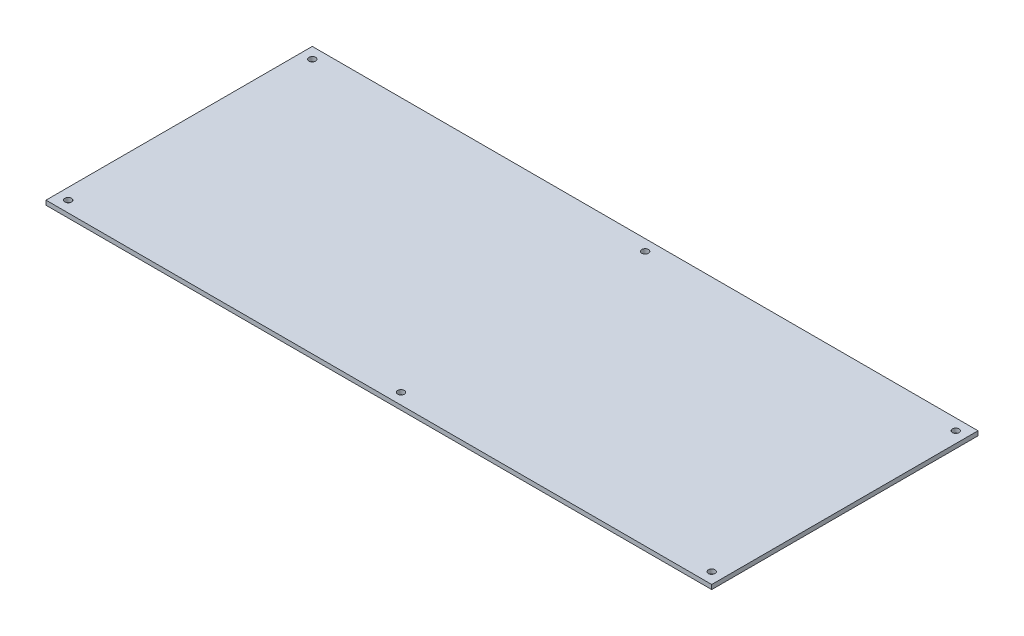
ISO-10303-21;
HEADER;
FILE_DESCRIPTION(('STEP AP214'),'2;1');
FILE_NAME('part.step','',(''),(''),'','','');
FILE_SCHEMA(('AUTOMOTIVE_DESIGN { 1 0 10303 214 1 1 1 1 }'));
ENDSEC;
DATA;
#1=APPLICATION_CONTEXT('core data for automotive mechanical design processes');
#2=APPLICATION_PROTOCOL_DEFINITION('international standard','automotive_design',2000,#1);
#3=PRODUCT_CONTEXT('',#1,'mechanical');
#4=PRODUCT('Part','Part','',(#3));
#5=PRODUCT_RELATED_PRODUCT_CATEGORY('part','',(#4));
#6=PRODUCT_DEFINITION_FORMATION('','',#4);
#7=PRODUCT_DEFINITION_CONTEXT('part definition',#1,'design');
#8=PRODUCT_DEFINITION('design','',#6,#7);
#9=PRODUCT_DEFINITION_SHAPE('','',#8);
#10=(LENGTH_UNIT() NAMED_UNIT(*) SI_UNIT(.MILLI.,.METRE.));
#11=(NAMED_UNIT(*) PLANE_ANGLE_UNIT() SI_UNIT($,.RADIAN.));
#12=(NAMED_UNIT(*) SI_UNIT($,.STERADIAN.) SOLID_ANGLE_UNIT());
#13=UNCERTAINTY_MEASURE_WITH_UNIT(LENGTH_MEASURE(1.E-05),#10,'distance_accuracy_value','');
#14=(GEOMETRIC_REPRESENTATION_CONTEXT(3) GLOBAL_UNCERTAINTY_ASSIGNED_CONTEXT((#13)) GLOBAL_UNIT_ASSIGNED_CONTEXT((#10,
#11,#12)) REPRESENTATION_CONTEXT('',''));
#15=CARTESIAN_POINT('',(0.,0.,0.));
#16=DIRECTION('',(0.,0.,1.));
#17=DIRECTION('',(1.,0.,0.));
#18=AXIS2_PLACEMENT_3D('',#15,#16,#17);
#19=CARTESIAN_POINT('',(0.,2.,0.));
#20=DIRECTION('',(0.,1.,0.));
#21=DIRECTION('',(0.,0.,1.));
#22=AXIS2_PLACEMENT_3D('',#19,#20,#21);
#23=PLANE('',#22);
#24=CARTESIAN_POINT('',(5.00000000000009,2.,-54.999999999999));
#25=DIRECTION('',(0.,1.,0.));
#26=DIRECTION('',(0.,0.,-1.));
#27=AXIS2_PLACEMENT_3D('',#24,#25,#26);
#28=CIRCLE('',#27,1.5);
#29=CARTESIAN_POINT('',(5.00000000000009,2.,-56.499999999999));
#30=VERTEX_POINT('',#29);
#31=EDGE_CURVE('E135',#30,#30,#28,.T.);
#32=ORIENTED_EDGE('',*,*,#31,.F.);
#33=EDGE_LOOP('',(#32));
#34=FACE_BOUND('',#33,.T.);
#35=CARTESIAN_POINT('',(-145.,2.,55.));
#36=DIRECTION('',(0.,1.,0.));
#37=DIRECTION('',(0.,0.,-1.));
#38=AXIS2_PLACEMENT_3D('',#35,#36,#37);
#39=CIRCLE('',#38,1.5);
#40=CARTESIAN_POINT('',(-145.,2.,53.5));
#41=VERTEX_POINT('',#40);
#42=EDGE_CURVE('E123',#41,#41,#39,.T.);
#43=ORIENTED_EDGE('',*,*,#42,.F.);
#44=EDGE_LOOP('',(#43));
#45=FACE_BOUND('',#44,.T.);
#46=CARTESIAN_POINT('',(-145.,2.,-54.9999999999999));
#47=DIRECTION('',(0.,1.,0.));
#48=DIRECTION('',(0.,0.,1.));
#49=AXIS2_PLACEMENT_3D('',#46,#47,#48);
#50=CIRCLE('',#49,1.5);
#51=CARTESIAN_POINT('',(-145.,2.,-53.5));
#52=VERTEX_POINT('',#51);
#53=EDGE_CURVE('E102',#52,#52,#50,.T.);
#54=ORIENTED_EDGE('',*,*,#53,.F.);
#55=EDGE_LOOP('',(#54));
#56=FACE_BOUND('',#55,.T.);
#57=DIRECTION('',(0.,0.,-1.));
#58=VECTOR('',#57,1.);
#59=CARTESIAN_POINT('',(150.,2.,-59.9999999999999));
#60=LINE('',#59,#58);
#61=CARTESIAN_POINT('',(150.,2.,60.0000000000001));
#62=VERTEX_POINT('',#61);
#63=CARTESIAN_POINT('',(150.,2.,-59.9999999999999));
#64=VERTEX_POINT('',#63);
#65=EDGE_CURVE('E87',#62,#64,#60,.T.);
#66=ORIENTED_EDGE('',*,*,#65,.T.);
#67=DIRECTION('',(-1.,0.,0.));
#68=VECTOR('',#67,1.);
#69=CARTESIAN_POINT('',(-150.,2.,-59.9999999999999));
#70=LINE('',#69,#68);
#71=CARTESIAN_POINT('',(-150.,2.,-59.9999999999999));
#72=VERTEX_POINT('',#71);
#73=EDGE_CURVE('E82',#64,#72,#70,.T.);
#74=ORIENTED_EDGE('',*,*,#73,.T.);
#75=DIRECTION('',(0.,0.,1.));
#76=VECTOR('',#75,1.);
#77=CARTESIAN_POINT('',(-150.,2.,-59.9999999999999));
#78=LINE('',#77,#76);
#79=CARTESIAN_POINT('',(-150.,2.,60.0000000000001));
#80=VERTEX_POINT('',#79);
#81=EDGE_CURVE('E85',#72,#80,#78,.T.);
#82=ORIENTED_EDGE('',*,*,#81,.T.);
#83=DIRECTION('',(1.,0.,0.));
#84=VECTOR('',#83,1.);
#85=CARTESIAN_POINT('',(-150.,2.,60.0000000000001));
#86=LINE('',#85,#84);
#87=EDGE_CURVE('E52',#80,#62,#86,.T.);
#88=ORIENTED_EDGE('',*,*,#87,.T.);
#89=EDGE_LOOP('',(#66,#74,#82,#88));
#90=FACE_BOUND('',#89,.T.);
#91=CARTESIAN_POINT('',(145.,2.,-54.9999999999999));
#92=DIRECTION('',(0.,1.,0.));
#93=DIRECTION('',(0.,0.,-1.));
#94=AXIS2_PLACEMENT_3D('',#91,#92,#93);
#95=CIRCLE('',#94,1.5);
#96=CARTESIAN_POINT('',(145.,2.,-56.4999999999999));
#97=VERTEX_POINT('',#96);
#98=EDGE_CURVE('E117',#97,#97,#95,.T.);
#99=ORIENTED_EDGE('',*,*,#98,.F.);
#100=EDGE_LOOP('',(#99));
#101=FACE_BOUND('',#100,.T.);
#102=CARTESIAN_POINT('',(145.,2.,55.));
#103=DIRECTION('',(0.,1.,0.));
#104=DIRECTION('',(0.,0.,1.));
#105=AXIS2_PLACEMENT_3D('',#102,#103,#104);
#106=CIRCLE('',#105,1.5);
#107=CARTESIAN_POINT('',(145.,2.,56.5));
#108=VERTEX_POINT('',#107);
#109=EDGE_CURVE('E129',#108,#108,#106,.T.);
#110=ORIENTED_EDGE('',*,*,#109,.F.);
#111=EDGE_LOOP('',(#110));
#112=FACE_BOUND('',#111,.T.);
#113=CARTESIAN_POINT('',(5.00000000000009,2.,55.000000000001));
#114=DIRECTION('',(0.,1.,0.));
#115=DIRECTION('',(0.,0.,1.));
#116=AXIS2_PLACEMENT_3D('',#113,#114,#115);
#117=CIRCLE('',#116,1.5);
#118=CARTESIAN_POINT('',(5.00000000000009,2.,56.500000000001));
#119=VERTEX_POINT('',#118);
#120=EDGE_CURVE('E141',#119,#119,#117,.T.);
#121=ORIENTED_EDGE('',*,*,#120,.F.);
#122=EDGE_LOOP('',(#121));
#123=FACE_BOUND('',#122,.T.);
#124=ADVANCED_FACE('F35',(#34,#45,#56,#90,#101,#112,#123),#23,.T.);
#125=CARTESIAN_POINT('',(0.,0.,0.));
#126=DIRECTION('',(0.,1.,0.));
#127=DIRECTION('',(0.,0.,1.));
#128=AXIS2_PLACEMENT_3D('',#125,#126,#127);
#129=PLANE('',#128);
#130=DIRECTION('',(0.,0.,-1.));
#131=VECTOR('',#130,1.);
#132=CARTESIAN_POINT('',(150.,0.,-59.9999999999999));
#133=LINE('',#132,#131);
#134=CARTESIAN_POINT('',(150.,0.,60.0000000000001));
#135=VERTEX_POINT('',#134);
#136=CARTESIAN_POINT('',(150.,0.,-59.9999999999999));
#137=VERTEX_POINT('',#136);
#138=EDGE_CURVE('E99',#135,#137,#133,.T.);
#139=ORIENTED_EDGE('',*,*,#138,.F.);
#140=DIRECTION('',(1.,0.,0.));
#141=VECTOR('',#140,1.);
#142=CARTESIAN_POINT('',(-150.,0.,60.0000000000001));
#143=LINE('',#142,#141);
#144=CARTESIAN_POINT('',(-150.,0.,60.0000000000001));
#145=VERTEX_POINT('',#144);
#146=EDGE_CURVE('E75',#145,#135,#143,.T.);
#147=ORIENTED_EDGE('',*,*,#146,.F.);
#148=DIRECTION('',(0.,0.,1.));
#149=VECTOR('',#148,1.);
#150=CARTESIAN_POINT('',(-150.,0.,-59.9999999999999));
#151=LINE('',#150,#149);
#152=CARTESIAN_POINT('',(-150.,0.,-59.9999999999999));
#153=VERTEX_POINT('',#152);
#154=EDGE_CURVE('E69',#153,#145,#151,.T.);
#155=ORIENTED_EDGE('',*,*,#154,.F.);
#156=DIRECTION('',(-1.,0.,0.));
#157=VECTOR('',#156,1.);
#158=CARTESIAN_POINT('',(-150.,0.,-59.9999999999999));
#159=LINE('',#158,#157);
#160=EDGE_CURVE('E91',#137,#153,#159,.T.);
#161=ORIENTED_EDGE('',*,*,#160,.F.);
#162=EDGE_LOOP('',(#139,#147,#155,#161));
#163=FACE_BOUND('',#162,.T.);
#164=CARTESIAN_POINT('',(-145.,0.,-54.9999999999999));
#165=DIRECTION('',(0.,1.,0.));
#166=DIRECTION('',(0.,0.,1.));
#167=AXIS2_PLACEMENT_3D('',#164,#165,#166);
#168=CIRCLE('',#167,1.5);
#169=CARTESIAN_POINT('',(-145.,0.,-53.5));
#170=VERTEX_POINT('',#169);
#171=EDGE_CURVE('E114',#170,#170,#168,.T.);
#172=ORIENTED_EDGE('',*,*,#171,.T.);
#173=EDGE_LOOP('',(#172));
#174=FACE_BOUND('',#173,.T.);
#175=CARTESIAN_POINT('',(145.,0.,-54.9999999999999));
#176=DIRECTION('',(0.,1.,0.));
#177=DIRECTION('',(0.,0.,-1.));
#178=AXIS2_PLACEMENT_3D('',#175,#176,#177);
#179=CIRCLE('',#178,1.5);
#180=CARTESIAN_POINT('',(145.,0.,-56.4999999999999));
#181=VERTEX_POINT('',#180);
#182=EDGE_CURVE('E120',#181,#181,#179,.T.);
#183=ORIENTED_EDGE('',*,*,#182,.T.);
#184=EDGE_LOOP('',(#183));
#185=FACE_BOUND('',#184,.T.);
#186=CARTESIAN_POINT('',(-145.,0.,55.));
#187=DIRECTION('',(0.,1.,0.));
#188=DIRECTION('',(0.,0.,-1.));
#189=AXIS2_PLACEMENT_3D('',#186,#187,#188);
#190=CIRCLE('',#189,1.5);
#191=CARTESIAN_POINT('',(-145.,0.,53.5));
#192=VERTEX_POINT('',#191);
#193=EDGE_CURVE('E126',#192,#192,#190,.T.);
#194=ORIENTED_EDGE('',*,*,#193,.T.);
#195=EDGE_LOOP('',(#194));
#196=FACE_BOUND('',#195,.T.);
#197=CARTESIAN_POINT('',(145.,0.,55.));
#198=DIRECTION('',(0.,1.,0.));
#199=DIRECTION('',(0.,0.,1.));
#200=AXIS2_PLACEMENT_3D('',#197,#198,#199);
#201=CIRCLE('',#200,1.5);
#202=CARTESIAN_POINT('',(145.,0.,56.5));
#203=VERTEX_POINT('',#202);
#204=EDGE_CURVE('E132',#203,#203,#201,.T.);
#205=ORIENTED_EDGE('',*,*,#204,.T.);
#206=EDGE_LOOP('',(#205));
#207=FACE_BOUND('',#206,.T.);
#208=CARTESIAN_POINT('',(5.00000000000009,0.,-54.999999999999));
#209=DIRECTION('',(0.,1.,0.));
#210=DIRECTION('',(0.,0.,-1.));
#211=AXIS2_PLACEMENT_3D('',#208,#209,#210);
#212=CIRCLE('',#211,1.5);
#213=CARTESIAN_POINT('',(5.00000000000009,0.,-56.499999999999));
#214=VERTEX_POINT('',#213);
#215=EDGE_CURVE('E138',#214,#214,#212,.T.);
#216=ORIENTED_EDGE('',*,*,#215,.T.);
#217=EDGE_LOOP('',(#216));
#218=FACE_BOUND('',#217,.T.);
#219=CARTESIAN_POINT('',(5.00000000000009,0.,55.000000000001));
#220=DIRECTION('',(0.,1.,0.));
#221=DIRECTION('',(0.,0.,1.));
#222=AXIS2_PLACEMENT_3D('',#219,#220,#221);
#223=CIRCLE('',#222,1.5);
#224=CARTESIAN_POINT('',(5.00000000000009,0.,56.500000000001));
#225=VERTEX_POINT('',#224);
#226=EDGE_CURVE('E144',#225,#225,#223,.T.);
#227=ORIENTED_EDGE('',*,*,#226,.T.);
#228=EDGE_LOOP('',(#227));
#229=FACE_BOUND('',#228,.T.);
#230=ADVANCED_FACE('F110',(#163,#174,#185,#196,#207,#218,#229),#129,.F.);
#231=CARTESIAN_POINT('',(150.,2.,-59.9999999999999));
#232=DIRECTION('',(-1.,0.,0.));
#233=DIRECTION('',(0.,0.,1.));
#234=AXIS2_PLACEMENT_3D('',#231,#232,#233);
#235=PLANE('',#234);
#236=ORIENTED_EDGE('',*,*,#138,.T.);
#237=DIRECTION('',(0.,-1.,0.));
#238=VECTOR('',#237,1.);
#239=CARTESIAN_POINT('',(150.,2.,-59.9999999999999));
#240=LINE('',#239,#238);
#241=EDGE_CURVE('E11',#64,#137,#240,.T.);
#242=ORIENTED_EDGE('',*,*,#241,.F.);
#243=ORIENTED_EDGE('',*,*,#65,.F.);
#244=DIRECTION('',(0.,-1.,0.));
#245=VECTOR('',#244,1.);
#246=CARTESIAN_POINT('',(150.,2.,60.0000000000001));
#247=LINE('',#246,#245);
#248=EDGE_CURVE('E95',#62,#135,#247,.T.);
#249=ORIENTED_EDGE('',*,*,#248,.T.);
#250=EDGE_LOOP('',(#236,#242,#243,#249));
#251=FACE_BOUND('',#250,.T.);
#252=ADVANCED_FACE('F37',(#251),#235,.F.);
#253=CARTESIAN_POINT('',(-150.,2.,-59.9999999999999));
#254=DIRECTION('',(0.,0.,1.));
#255=DIRECTION('',(1.,0.,0.));
#256=AXIS2_PLACEMENT_3D('',#253,#254,#255);
#257=PLANE('',#256);
#258=ORIENTED_EDGE('',*,*,#160,.T.);
#259=DIRECTION('',(0.,-1.,0.));
#260=VECTOR('',#259,1.);
#261=CARTESIAN_POINT('',(-150.,2.,-59.9999999999999));
#262=LINE('',#261,#260);
#263=EDGE_CURVE('E44',#72,#153,#262,.T.);
#264=ORIENTED_EDGE('',*,*,#263,.F.);
#265=ORIENTED_EDGE('',*,*,#73,.F.);
#266=ORIENTED_EDGE('',*,*,#241,.T.);
#267=EDGE_LOOP('',(#258,#264,#265,#266));
#268=FACE_BOUND('',#267,.T.);
#269=ADVANCED_FACE('F90',(#268),#257,.F.);
#270=CARTESIAN_POINT('',(-150.,2.,-59.9999999999999));
#271=DIRECTION('',(1.,0.,0.));
#272=DIRECTION('',(0.,0.,-1.));
#273=AXIS2_PLACEMENT_3D('',#270,#271,#272);
#274=PLANE('',#273);
#275=ORIENTED_EDGE('',*,*,#154,.T.);
#276=DIRECTION('',(0.,-1.,0.));
#277=VECTOR('',#276,1.);
#278=CARTESIAN_POINT('',(-150.,2.,60.0000000000001));
#279=LINE('',#278,#277);
#280=EDGE_CURVE('E92',#80,#145,#279,.T.);
#281=ORIENTED_EDGE('',*,*,#280,.F.);
#282=ORIENTED_EDGE('',*,*,#81,.F.);
#283=ORIENTED_EDGE('',*,*,#263,.T.);
#284=EDGE_LOOP('',(#275,#281,#282,#283));
#285=FACE_BOUND('',#284,.T.);
#286=ADVANCED_FACE('F93',(#285),#274,.F.);
#287=CARTESIAN_POINT('',(-150.,2.,60.0000000000001));
#288=DIRECTION('',(0.,0.,-1.));
#289=DIRECTION('',(-1.,0.,0.));
#290=AXIS2_PLACEMENT_3D('',#287,#288,#289);
#291=PLANE('',#290);
#292=ORIENTED_EDGE('',*,*,#146,.T.);
#293=ORIENTED_EDGE('',*,*,#248,.F.);
#294=ORIENTED_EDGE('',*,*,#87,.F.);
#295=ORIENTED_EDGE('',*,*,#280,.T.);
#296=EDGE_LOOP('',(#292,#293,#294,#295));
#297=FACE_BOUND('',#296,.T.);
#298=ADVANCED_FACE('F107',(#297),#291,.F.);
#299=CARTESIAN_POINT('',(-145.,2.,-54.9999999999999));
#300=DIRECTION('',(0.,-1.,0.));
#301=DIRECTION('',(0.,0.,-1.));
#302=AXIS2_PLACEMENT_3D('',#299,#300,#301);
#303=CYLINDRICAL_SURFACE('',#302,1.5);
#304=ORIENTED_EDGE('',*,*,#53,.T.);
#305=EDGE_LOOP('',(#304));
#306=FACE_BOUND('',#305,.T.);
#307=ORIENTED_EDGE('',*,*,#171,.F.);
#308=EDGE_LOOP('',(#307));
#309=FACE_BOUND('',#308,.T.);
#310=ADVANCED_FACE('F163',(#306,#309),#303,.F.);
#311=CARTESIAN_POINT('',(145.,2.,-54.9999999999999));
#312=DIRECTION('',(0.,-1.,0.));
#313=DIRECTION('',(0.,0.,-1.));
#314=AXIS2_PLACEMENT_3D('',#311,#312,#313);
#315=CYLINDRICAL_SURFACE('',#314,1.5);
#316=ORIENTED_EDGE('',*,*,#98,.T.);
#317=EDGE_LOOP('',(#316));
#318=FACE_BOUND('',#317,.T.);
#319=ORIENTED_EDGE('',*,*,#182,.F.);
#320=EDGE_LOOP('',(#319));
#321=FACE_BOUND('',#320,.T.);
#322=ADVANCED_FACE('F209',(#318,#321),#315,.F.);
#323=CARTESIAN_POINT('',(-145.,2.,55.));
#324=DIRECTION('',(0.,-1.,0.));
#325=DIRECTION('',(0.,0.,-1.));
#326=AXIS2_PLACEMENT_3D('',#323,#324,#325);
#327=CYLINDRICAL_SURFACE('',#326,1.5);
#328=ORIENTED_EDGE('',*,*,#42,.T.);
#329=EDGE_LOOP('',(#328));
#330=FACE_BOUND('',#329,.T.);
#331=ORIENTED_EDGE('',*,*,#193,.F.);
#332=EDGE_LOOP('',(#331));
#333=FACE_BOUND('',#332,.T.);
#334=ADVANCED_FACE('F217',(#330,#333),#327,.F.);
#335=CARTESIAN_POINT('',(145.,2.,55.));
#336=DIRECTION('',(0.,-1.,0.));
#337=DIRECTION('',(0.,0.,-1.));
#338=AXIS2_PLACEMENT_3D('',#335,#336,#337);
#339=CYLINDRICAL_SURFACE('',#338,1.5);
#340=ORIENTED_EDGE('',*,*,#109,.T.);
#341=EDGE_LOOP('',(#340));
#342=FACE_BOUND('',#341,.T.);
#343=ORIENTED_EDGE('',*,*,#204,.F.);
#344=EDGE_LOOP('',(#343));
#345=FACE_BOUND('',#344,.T.);
#346=ADVANCED_FACE('F225',(#342,#345),#339,.F.);
#347=CARTESIAN_POINT('',(5.00000000000009,2.,-54.999999999999));
#348=DIRECTION('',(0.,-1.,0.));
#349=DIRECTION('',(0.,0.,-1.));
#350=AXIS2_PLACEMENT_3D('',#347,#348,#349);
#351=CYLINDRICAL_SURFACE('',#350,1.5);
#352=ORIENTED_EDGE('',*,*,#31,.T.);
#353=EDGE_LOOP('',(#352));
#354=FACE_BOUND('',#353,.T.);
#355=ORIENTED_EDGE('',*,*,#215,.F.);
#356=EDGE_LOOP('',(#355));
#357=FACE_BOUND('',#356,.T.);
#358=ADVANCED_FACE('F234',(#354,#357),#351,.F.);
#359=CARTESIAN_POINT('',(5.00000000000009,2.,55.000000000001));
#360=DIRECTION('',(0.,-1.,0.));
#361=DIRECTION('',(0.,0.,-1.));
#362=AXIS2_PLACEMENT_3D('',#359,#360,#361);
#363=CYLINDRICAL_SURFACE('',#362,1.5);
#364=ORIENTED_EDGE('',*,*,#120,.T.);
#365=EDGE_LOOP('',(#364));
#366=FACE_BOUND('',#365,.T.);
#367=ORIENTED_EDGE('',*,*,#226,.F.);
#368=EDGE_LOOP('',(#367));
#369=FACE_BOUND('',#368,.T.);
#370=ADVANCED_FACE('F150',(#366,#369),#363,.F.);
#371=CLOSED_SHELL('',(#124,#230,#252,#269,#286,#298,#310,#322,#334,#346,#358,#370));
#372=MANIFOLD_SOLID_BREP('B2',#371);
#373=ADVANCED_BREP_SHAPE_REPRESENTATION('',(#18,#372),#14);
#374=SHAPE_DEFINITION_REPRESENTATION(#9,#373);
ENDSEC;
END-ISO-10303-21;
